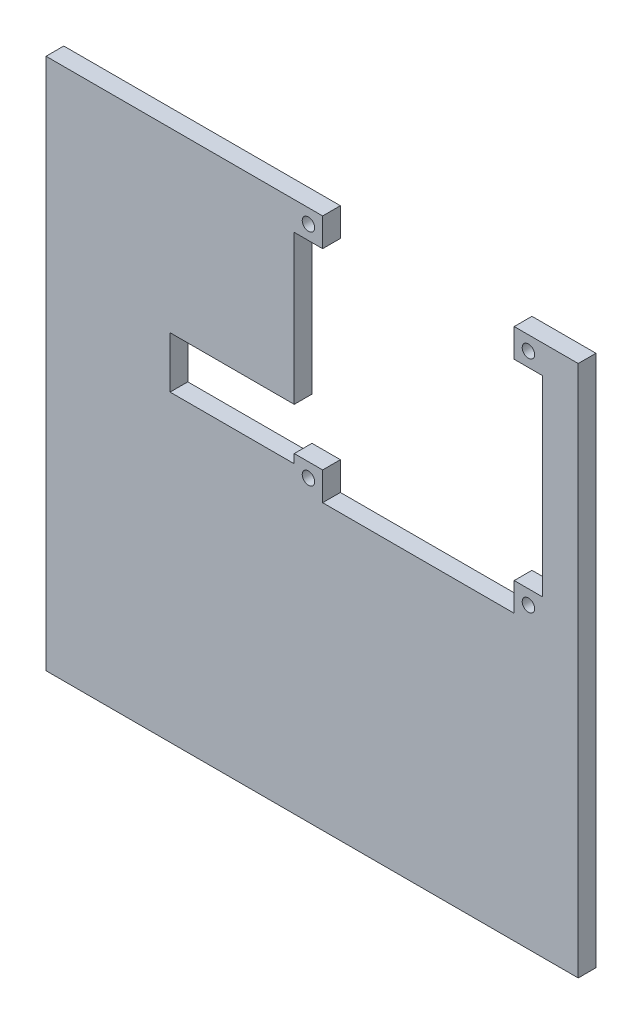
ISO-10303-21;
HEADER;
FILE_DESCRIPTION(('STEP AP214'),'2;1');
FILE_NAME('part.step','',(''),(''),'','','');
FILE_SCHEMA(('AUTOMOTIVE_DESIGN { 1 0 10303 214 1 1 1 1 }'));
ENDSEC;
DATA;
#1=APPLICATION_CONTEXT('core data for automotive mechanical design processes');
#2=APPLICATION_PROTOCOL_DEFINITION('international standard','automotive_design',2000,#1);
#3=PRODUCT_CONTEXT('',#1,'mechanical');
#4=PRODUCT('Part','Part','',(#3));
#5=PRODUCT_RELATED_PRODUCT_CATEGORY('part','',(#4));
#6=PRODUCT_DEFINITION_FORMATION('','',#4);
#7=PRODUCT_DEFINITION_CONTEXT('part definition',#1,'design');
#8=PRODUCT_DEFINITION('design','',#6,#7);
#9=PRODUCT_DEFINITION_SHAPE('','',#8);
#10=(LENGTH_UNIT() NAMED_UNIT(*) SI_UNIT(.MILLI.,.METRE.));
#11=(NAMED_UNIT(*) PLANE_ANGLE_UNIT() SI_UNIT($,.RADIAN.));
#12=(NAMED_UNIT(*) SI_UNIT($,.STERADIAN.) SOLID_ANGLE_UNIT());
#13=UNCERTAINTY_MEASURE_WITH_UNIT(LENGTH_MEASURE(1.E-05),#10,'distance_accuracy_value','');
#14=(GEOMETRIC_REPRESENTATION_CONTEXT(3) GLOBAL_UNCERTAINTY_ASSIGNED_CONTEXT((#13)) GLOBAL_UNIT_ASSIGNED_CONTEXT((#10,
#11,#12)) REPRESENTATION_CONTEXT('',''));
#15=CARTESIAN_POINT('',(0.,0.,0.));
#16=DIRECTION('',(0.,0.,1.));
#17=DIRECTION('',(1.,0.,0.));
#18=AXIS2_PLACEMENT_3D('',#15,#16,#17);
#19=CARTESIAN_POINT('',(0.,150.,5.));
#20=DIRECTION('',(0.,-1.,0.));
#21=DIRECTION('',(0.,0.,-1.));
#22=AXIS2_PLACEMENT_3D('',#19,#20,#21);
#23=PLANE('',#22);
#24=DIRECTION('',(-1.,0.,0.));
#25=VECTOR('',#24,1.);
#26=CARTESIAN_POINT('',(0.,150.,5.));
#27=LINE('',#26,#25);
#28=CARTESIAN_POINT('',(77.9600185654131,150.,5.));
#29=VERTEX_POINT('',#28);
#30=CARTESIAN_POINT('',(0.,150.,5.));
#31=VERTEX_POINT('',#30);
#32=EDGE_CURVE('E328',#29,#31,#27,.T.);
#33=ORIENTED_EDGE('',*,*,#32,.F.);
#34=DIRECTION('',(0.,0.,1.));
#35=VECTOR('',#34,1.);
#36=CARTESIAN_POINT('',(77.9600185654131,150.,0.));
#37=LINE('',#36,#35);
#38=CARTESIAN_POINT('',(77.9600185654131,150.,0.));
#39=VERTEX_POINT('',#38);
#40=EDGE_CURVE('E294',#39,#29,#37,.T.);
#41=ORIENTED_EDGE('',*,*,#40,.F.);
#42=DIRECTION('',(-1.,0.,0.));
#43=VECTOR('',#42,1.);
#44=CARTESIAN_POINT('',(0.,150.,0.));
#45=LINE('',#44,#43);
#46=CARTESIAN_POINT('',(0.,150.,0.));
#47=VERTEX_POINT('',#46);
#48=EDGE_CURVE('E339',#39,#47,#45,.T.);
#49=ORIENTED_EDGE('',*,*,#48,.T.);
#50=DIRECTION('',(0.,0.,-1.));
#51=VECTOR('',#50,1.);
#52=CARTESIAN_POINT('',(0.,150.,5.));
#53=LINE('',#52,#51);
#54=EDGE_CURVE('E332',#31,#47,#53,.T.);
#55=ORIENTED_EDGE('',*,*,#54,.F.);
#56=EDGE_LOOP('',(#33,#41,#49,#55));
#57=FACE_BOUND('',#56,.T.);
#58=ADVANCED_FACE('F32',(#57),#23,.F.);
#59=CARTESIAN_POINT('',(0.,0.,5.));
#60=DIRECTION('',(1.,0.,0.));
#61=DIRECTION('',(0.,0.,-1.));
#62=AXIS2_PLACEMENT_3D('',#59,#60,#61);
#63=PLANE('',#62);
#64=DIRECTION('',(0.,-1.,0.));
#65=VECTOR('',#64,1.);
#66=CARTESIAN_POINT('',(0.,0.,0.));
#67=LINE('',#66,#65);
#68=CARTESIAN_POINT('',(0.,0.,0.));
#69=VERTEX_POINT('',#68);
#70=EDGE_CURVE('E296',#47,#69,#67,.T.);
#71=ORIENTED_EDGE('',*,*,#70,.T.);
#72=DIRECTION('',(0.,0.,-1.));
#73=VECTOR('',#72,1.);
#74=CARTESIAN_POINT('',(0.,0.,5.));
#75=LINE('',#74,#73);
#76=CARTESIAN_POINT('',(0.,0.,5.));
#77=VERTEX_POINT('',#76);
#78=EDGE_CURVE('E11',#77,#69,#75,.T.);
#79=ORIENTED_EDGE('',*,*,#78,.F.);
#80=DIRECTION('',(0.,-1.,0.));
#81=VECTOR('',#80,1.);
#82=CARTESIAN_POINT('',(0.,0.,5.));
#83=LINE('',#82,#81);
#84=EDGE_CURVE('E320',#31,#77,#83,.T.);
#85=ORIENTED_EDGE('',*,*,#84,.F.);
#86=ORIENTED_EDGE('',*,*,#54,.T.);
#87=EDGE_LOOP('',(#71,#79,#85,#86));
#88=FACE_BOUND('',#87,.T.);
#89=ADVANCED_FACE('F34',(#88),#63,.F.);
#90=CARTESIAN_POINT('',(0.,0.,5.));
#91=DIRECTION('',(0.,1.,0.));
#92=DIRECTION('',(0.,0.,1.));
#93=AXIS2_PLACEMENT_3D('',#90,#91,#92);
#94=PLANE('',#93);
#95=DIRECTION('',(1.,0.,0.));
#96=VECTOR('',#95,1.);
#97=CARTESIAN_POINT('',(0.,0.,0.));
#98=LINE('',#97,#96);
#99=CARTESIAN_POINT('',(150.,0.,0.));
#100=VERTEX_POINT('',#99);
#101=EDGE_CURVE('E335',#69,#100,#98,.T.);
#102=ORIENTED_EDGE('',*,*,#101,.T.);
#103=DIRECTION('',(0.,0.,-1.));
#104=VECTOR('',#103,1.);
#105=CARTESIAN_POINT('',(150.,0.,5.));
#106=LINE('',#105,#104);
#107=CARTESIAN_POINT('',(150.,0.,5.));
#108=VERTEX_POINT('',#107);
#109=EDGE_CURVE('E40',#108,#100,#106,.T.);
#110=ORIENTED_EDGE('',*,*,#109,.F.);
#111=DIRECTION('',(1.,0.,0.));
#112=VECTOR('',#111,1.);
#113=CARTESIAN_POINT('',(0.,0.,5.));
#114=LINE('',#113,#112);
#115=EDGE_CURVE('E323',#77,#108,#114,.T.);
#116=ORIENTED_EDGE('',*,*,#115,.F.);
#117=ORIENTED_EDGE('',*,*,#78,.T.);
#118=EDGE_LOOP('',(#102,#110,#116,#117));
#119=FACE_BOUND('',#118,.T.);
#120=ADVANCED_FACE('F367',(#119),#94,.F.);
#121=CARTESIAN_POINT('',(150.,0.,5.));
#122=DIRECTION('',(-1.,0.,0.));
#123=DIRECTION('',(0.,0.,1.));
#124=AXIS2_PLACEMENT_3D('',#121,#122,#123);
#125=PLANE('',#124);
#126=DIRECTION('',(0.,1.,0.));
#127=VECTOR('',#126,1.);
#128=CARTESIAN_POINT('',(150.,0.,0.));
#129=LINE('',#128,#127);
#130=CARTESIAN_POINT('',(150.,150.,0.));
#131=VERTEX_POINT('',#130);
#132=EDGE_CURVE('E337',#100,#131,#129,.T.);
#133=ORIENTED_EDGE('',*,*,#132,.T.);
#134=DIRECTION('',(0.,0.,-1.));
#135=VECTOR('',#134,1.);
#136=CARTESIAN_POINT('',(150.,150.,5.));
#137=LINE('',#136,#135);
#138=CARTESIAN_POINT('',(150.,150.,5.));
#139=VERTEX_POINT('',#138);
#140=EDGE_CURVE('E344',#139,#131,#137,.T.);
#141=ORIENTED_EDGE('',*,*,#140,.F.);
#142=DIRECTION('',(0.,1.,0.));
#143=VECTOR('',#142,1.);
#144=CARTESIAN_POINT('',(150.,0.,5.));
#145=LINE('',#144,#143);
#146=EDGE_CURVE('E326',#108,#139,#145,.T.);
#147=ORIENTED_EDGE('',*,*,#146,.F.);
#148=ORIENTED_EDGE('',*,*,#109,.T.);
#149=EDGE_LOOP('',(#133,#141,#147,#148));
#150=FACE_BOUND('',#149,.T.);
#151=ADVANCED_FACE('F351',(#150),#125,.F.);
#152=CARTESIAN_POINT('',(131.960018565413,150.,0.));
#153=VERTEX_POINT('',#152);
#154=EDGE_CURVE('E324',#131,#153,#45,.T.);
#155=ORIENTED_EDGE('',*,*,#154,.T.);
#156=DIRECTION('',(0.,0.,1.));
#157=VECTOR('',#156,1.);
#158=CARTESIAN_POINT('',(131.960018565413,150.,0.));
#159=LINE('',#158,#157);
#160=CARTESIAN_POINT('',(131.960018565413,150.,5.));
#161=VERTEX_POINT('',#160);
#162=EDGE_CURVE('E297',#153,#161,#159,.T.);
#163=ORIENTED_EDGE('',*,*,#162,.T.);
#164=EDGE_CURVE('E329',#139,#161,#27,.T.);
#165=ORIENTED_EDGE('',*,*,#164,.F.);
#166=ORIENTED_EDGE('',*,*,#140,.T.);
#167=EDGE_LOOP('',(#155,#163,#165,#166));
#168=FACE_BOUND('',#167,.T.);
#169=ADVANCED_FACE('F358',(#168),#23,.F.);
#170=CARTESIAN_POINT('',(0.,0.,5.));
#171=DIRECTION('',(0.,0.,-1.));
#172=DIRECTION('',(-1.,0.,0.));
#173=AXIS2_PLACEMENT_3D('',#170,#171,#172);
#174=PLANE('',#173);
#175=CARTESIAN_POINT('',(135.960018565413,84.,5.));
#176=DIRECTION('',(0.,0.,1.));
#177=DIRECTION('',(1.,0.,0.));
#178=AXIS2_PLACEMENT_3D('',#175,#176,#177);
#179=CIRCLE('',#178,1.75000000000001);
#180=CARTESIAN_POINT('',(137.710018565413,84.,5.));
#181=VERTEX_POINT('',#180);
#182=EDGE_CURVE('E205',#181,#181,#179,.T.);
#183=ORIENTED_EDGE('',*,*,#182,.F.);
#184=EDGE_LOOP('',(#183));
#185=FACE_BOUND('',#184,.T.);
#186=CARTESIAN_POINT('',(135.960018565413,146.,5.));
#187=DIRECTION('',(0.,0.,1.));
#188=DIRECTION('',(1.,0.,0.));
#189=AXIS2_PLACEMENT_3D('',#186,#187,#188);
#190=CIRCLE('',#189,1.75000000000001);
#191=CARTESIAN_POINT('',(137.710018565413,146.,5.));
#192=VERTEX_POINT('',#191);
#193=EDGE_CURVE('E224',#192,#192,#190,.T.);
#194=ORIENTED_EDGE('',*,*,#193,.F.);
#195=EDGE_LOOP('',(#194));
#196=FACE_BOUND('',#195,.T.);
#197=CARTESIAN_POINT('',(73.9600185654131,146.,5.));
#198=DIRECTION('',(0.,0.,1.));
#199=DIRECTION('',(1.,0.,0.));
#200=AXIS2_PLACEMENT_3D('',#197,#198,#199);
#201=CIRCLE('',#200,1.75);
#202=CARTESIAN_POINT('',(75.7100185654131,146.,5.));
#203=VERTEX_POINT('',#202);
#204=EDGE_CURVE('E218',#203,#203,#201,.T.);
#205=ORIENTED_EDGE('',*,*,#204,.F.);
#206=EDGE_LOOP('',(#205));
#207=FACE_BOUND('',#206,.T.);
#208=CARTESIAN_POINT('',(73.960018565413,84.,5.));
#209=DIRECTION('',(0.,0.,1.));
#210=DIRECTION('',(1.,0.,0.));
#211=AXIS2_PLACEMENT_3D('',#208,#209,#210);
#212=CIRCLE('',#211,1.75);
#213=CARTESIAN_POINT('',(75.710018565413,84.,5.));
#214=VERTEX_POINT('',#213);
#215=EDGE_CURVE('E212',#214,#214,#212,.T.);
#216=ORIENTED_EDGE('',*,*,#215,.F.);
#217=EDGE_LOOP('',(#216));
#218=FACE_BOUND('',#217,.T.);
#219=DIRECTION('',(1.,0.,0.));
#220=VECTOR('',#219,1.);
#221=CARTESIAN_POINT('',(77.9600185654131,87.9999999999999,5.));
#222=LINE('',#221,#220);
#223=CARTESIAN_POINT('',(69.960018565413,87.9999999999999,5.));
#224=VERTEX_POINT('',#223);
#225=CARTESIAN_POINT('',(77.9600185654131,87.9999999999999,5.));
#226=VERTEX_POINT('',#225);
#227=EDGE_CURVE('E272',#224,#226,#222,.T.);
#228=ORIENTED_EDGE('',*,*,#227,.F.);
#229=DIRECTION('',(0.,1.,0.));
#230=VECTOR('',#229,1.);
#231=CARTESIAN_POINT('',(69.960018565413,85.5,5.));
#232=LINE('',#231,#230);
#233=CARTESIAN_POINT('',(69.960018565413,85.5,5.));
#234=VERTEX_POINT('',#233);
#235=EDGE_CURVE('E196',#234,#224,#232,.T.);
#236=ORIENTED_EDGE('',*,*,#235,.F.);
#237=DIRECTION('',(1.,0.,0.));
#238=VECTOR('',#237,1.);
#239=CARTESIAN_POINT('',(69.960018565413,85.5,5.));
#240=LINE('',#239,#238);
#241=CARTESIAN_POINT('',(34.960018565413,85.5,5.));
#242=VERTEX_POINT('',#241);
#243=EDGE_CURVE('E192',#242,#234,#240,.T.);
#244=ORIENTED_EDGE('',*,*,#243,.F.);
#245=DIRECTION('',(0.,-1.,0.));
#246=VECTOR('',#245,1.);
#247=CARTESIAN_POINT('',(34.960018565413,85.5,5.));
#248=LINE('',#247,#246);
#249=CARTESIAN_POINT('',(34.960018565413,100.,5.));
#250=VERTEX_POINT('',#249);
#251=EDGE_CURVE('E199',#250,#242,#248,.T.);
#252=ORIENTED_EDGE('',*,*,#251,.F.);
#253=DIRECTION('',(-1.,0.,0.));
#254=VECTOR('',#253,1.);
#255=CARTESIAN_POINT('',(69.960018565413,100.,5.));
#256=LINE('',#255,#254);
#257=CARTESIAN_POINT('',(69.960018565413,100.,5.));
#258=VERTEX_POINT('',#257);
#259=EDGE_CURVE('E171',#258,#250,#256,.T.);
#260=ORIENTED_EDGE('',*,*,#259,.F.);
#261=DIRECTION('',(0.,-1.,0.));
#262=VECTOR('',#261,1.);
#263=CARTESIAN_POINT('',(69.960018565413,87.9999999999999,5.));
#264=LINE('',#263,#262);
#265=CARTESIAN_POINT('',(69.960018565413,142.,5.));
#266=VERTEX_POINT('',#265);
#267=EDGE_CURVE('E269',#266,#258,#264,.T.);
#268=ORIENTED_EDGE('',*,*,#267,.F.);
#269=DIRECTION('',(-1.,0.,0.));
#270=VECTOR('',#269,1.);
#271=CARTESIAN_POINT('',(69.960018565413,142.,5.));
#272=LINE('',#271,#270);
#273=CARTESIAN_POINT('',(77.9600185654131,142.,5.));
#274=VERTEX_POINT('',#273);
#275=EDGE_CURVE('E266',#274,#266,#272,.T.);
#276=ORIENTED_EDGE('',*,*,#275,.F.);
#277=DIRECTION('',(0.,-1.,0.));
#278=VECTOR('',#277,1.);
#279=CARTESIAN_POINT('',(77.9600185654131,142.,5.));
#280=LINE('',#279,#278);
#281=EDGE_CURVE('E211',#29,#274,#280,.T.);
#282=ORIENTED_EDGE('',*,*,#281,.F.);
#283=ORIENTED_EDGE('',*,*,#32,.T.);
#284=ORIENTED_EDGE('',*,*,#84,.T.);
#285=ORIENTED_EDGE('',*,*,#115,.T.);
#286=ORIENTED_EDGE('',*,*,#146,.T.);
#287=ORIENTED_EDGE('',*,*,#164,.T.);
#288=DIRECTION('',(0.,1.,0.));
#289=VECTOR('',#288,1.);
#290=CARTESIAN_POINT('',(131.960018565413,150.,5.));
#291=LINE('',#290,#289);
#292=CARTESIAN_POINT('',(131.960018565413,142.,5.));
#293=VERTEX_POINT('',#292);
#294=EDGE_CURVE('E236',#293,#161,#291,.T.);
#295=ORIENTED_EDGE('',*,*,#294,.F.);
#296=DIRECTION('',(-1.,0.,0.));
#297=VECTOR('',#296,1.);
#298=CARTESIAN_POINT('',(131.960018565413,142.,5.));
#299=LINE('',#298,#297);
#300=CARTESIAN_POINT('',(139.960018565413,142.,5.));
#301=VERTEX_POINT('',#300);
#302=EDGE_CURVE('E290',#301,#293,#299,.T.);
#303=ORIENTED_EDGE('',*,*,#302,.F.);
#304=DIRECTION('',(0.,1.,0.));
#305=VECTOR('',#304,1.);
#306=CARTESIAN_POINT('',(139.960018565413,142.,5.));
#307=LINE('',#306,#305);
#308=CARTESIAN_POINT('',(139.960018565413,88.,5.));
#309=VERTEX_POINT('',#308);
#310=EDGE_CURVE('E287',#309,#301,#307,.T.);
#311=ORIENTED_EDGE('',*,*,#310,.F.);
#312=DIRECTION('',(1.,0.,0.));
#313=VECTOR('',#312,1.);
#314=CARTESIAN_POINT('',(139.960018565413,88.,5.));
#315=LINE('',#314,#313);
#316=CARTESIAN_POINT('',(131.960018565413,88.,5.));
#317=VERTEX_POINT('',#316);
#318=EDGE_CURVE('E284',#317,#309,#315,.T.);
#319=ORIENTED_EDGE('',*,*,#318,.F.);
#320=DIRECTION('',(0.,1.,0.));
#321=VECTOR('',#320,1.);
#322=CARTESIAN_POINT('',(131.960018565413,88.,5.));
#323=LINE('',#322,#321);
#324=CARTESIAN_POINT('',(131.960018565413,80.,5.));
#325=VERTEX_POINT('',#324);
#326=EDGE_CURVE('E281',#325,#317,#323,.T.);
#327=ORIENTED_EDGE('',*,*,#326,.F.);
#328=DIRECTION('',(1.,0.,0.));
#329=VECTOR('',#328,1.);
#330=CARTESIAN_POINT('',(131.960018565413,80.,5.));
#331=LINE('',#330,#329);
#332=CARTESIAN_POINT('',(77.9600185654131,80.,5.));
#333=VERTEX_POINT('',#332);
#334=EDGE_CURVE('E278',#333,#325,#331,.T.);
#335=ORIENTED_EDGE('',*,*,#334,.F.);
#336=DIRECTION('',(0.,-1.,0.));
#337=VECTOR('',#336,1.);
#338=CARTESIAN_POINT('',(77.9600185654131,80.,5.));
#339=LINE('',#338,#337);
#340=EDGE_CURVE('E275',#226,#333,#339,.T.);
#341=ORIENTED_EDGE('',*,*,#340,.F.);
#342=EDGE_LOOP('',(#228,#236,#244,#252,#260,#268,#276,#282,#283,#284,#285,#286,#287,#295,#303,
#311,#319,#327,#335,#341));
#343=FACE_BOUND('',#342,.T.);
#344=ADVANCED_FACE('F363',(#185,#196,#207,#218,#343),#174,.F.);
#345=CARTESIAN_POINT('',(0.,0.,0.));
#346=DIRECTION('',(0.,0.,-1.));
#347=DIRECTION('',(-1.,0.,0.));
#348=AXIS2_PLACEMENT_3D('',#345,#346,#347);
#349=PLANE('',#348);
#350=DIRECTION('',(0.,1.,0.));
#351=VECTOR('',#350,1.);
#352=CARTESIAN_POINT('',(69.960018565413,85.5,0.));
#353=LINE('',#352,#351);
#354=CARTESIAN_POINT('',(69.960018565413,85.5,0.));
#355=VERTEX_POINT('',#354);
#356=CARTESIAN_POINT('',(69.960018565413,87.9999999999999,0.));
#357=VERTEX_POINT('',#356);
#358=EDGE_CURVE('E190',#355,#357,#353,.T.);
#359=ORIENTED_EDGE('',*,*,#358,.T.);
#360=DIRECTION('',(1.,0.,0.));
#361=VECTOR('',#360,1.);
#362=CARTESIAN_POINT('',(77.9600185654131,87.9999999999999,0.));
#363=LINE('',#362,#361);
#364=CARTESIAN_POINT('',(77.9600185654131,87.9999999999999,0.));
#365=VERTEX_POINT('',#364);
#366=EDGE_CURVE('E239',#357,#365,#363,.T.);
#367=ORIENTED_EDGE('',*,*,#366,.T.);
#368=DIRECTION('',(0.,-1.,0.));
#369=VECTOR('',#368,1.);
#370=CARTESIAN_POINT('',(77.9600185654131,80.,0.));
#371=LINE('',#370,#369);
#372=CARTESIAN_POINT('',(77.9600185654131,80.,0.));
#373=VERTEX_POINT('',#372);
#374=EDGE_CURVE('E242',#365,#373,#371,.T.);
#375=ORIENTED_EDGE('',*,*,#374,.T.);
#376=DIRECTION('',(1.,0.,0.));
#377=VECTOR('',#376,1.);
#378=CARTESIAN_POINT('',(131.960018565413,80.,0.));
#379=LINE('',#378,#377);
#380=CARTESIAN_POINT('',(131.960018565413,80.,0.));
#381=VERTEX_POINT('',#380);
#382=EDGE_CURVE('E245',#373,#381,#379,.T.);
#383=ORIENTED_EDGE('',*,*,#382,.T.);
#384=DIRECTION('',(0.,1.,0.));
#385=VECTOR('',#384,1.);
#386=CARTESIAN_POINT('',(131.960018565413,88.,0.));
#387=LINE('',#386,#385);
#388=CARTESIAN_POINT('',(131.960018565413,88.,0.));
#389=VERTEX_POINT('',#388);
#390=EDGE_CURVE('E248',#381,#389,#387,.T.);
#391=ORIENTED_EDGE('',*,*,#390,.T.);
#392=DIRECTION('',(1.,0.,0.));
#393=VECTOR('',#392,1.);
#394=CARTESIAN_POINT('',(139.960018565413,88.,0.));
#395=LINE('',#394,#393);
#396=CARTESIAN_POINT('',(139.960018565413,88.,0.));
#397=VERTEX_POINT('',#396);
#398=EDGE_CURVE('E251',#389,#397,#395,.T.);
#399=ORIENTED_EDGE('',*,*,#398,.T.);
#400=DIRECTION('',(0.,1.,0.));
#401=VECTOR('',#400,1.);
#402=CARTESIAN_POINT('',(139.960018565413,142.,0.));
#403=LINE('',#402,#401);
#404=CARTESIAN_POINT('',(139.960018565413,142.,0.));
#405=VERTEX_POINT('',#404);
#406=EDGE_CURVE('E254',#397,#405,#403,.T.);
#407=ORIENTED_EDGE('',*,*,#406,.T.);
#408=DIRECTION('',(-1.,0.,0.));
#409=VECTOR('',#408,1.);
#410=CARTESIAN_POINT('',(131.960018565413,142.,0.));
#411=LINE('',#410,#409);
#412=CARTESIAN_POINT('',(131.960018565413,142.,0.));
#413=VERTEX_POINT('',#412);
#414=EDGE_CURVE('E257',#405,#413,#411,.T.);
#415=ORIENTED_EDGE('',*,*,#414,.T.);
#416=DIRECTION('',(0.,1.,0.));
#417=VECTOR('',#416,1.);
#418=CARTESIAN_POINT('',(131.960018565413,150.,0.));
#419=LINE('',#418,#417);
#420=EDGE_CURVE('E260',#413,#153,#419,.T.);
#421=ORIENTED_EDGE('',*,*,#420,.T.);
#422=ORIENTED_EDGE('',*,*,#154,.F.);
#423=ORIENTED_EDGE('',*,*,#132,.F.);
#424=ORIENTED_EDGE('',*,*,#101,.F.);
#425=ORIENTED_EDGE('',*,*,#70,.F.);
#426=ORIENTED_EDGE('',*,*,#48,.F.);
#427=DIRECTION('',(0.,-1.,0.));
#428=VECTOR('',#427,1.);
#429=CARTESIAN_POINT('',(77.9600185654131,142.,0.));
#430=LINE('',#429,#428);
#431=CARTESIAN_POINT('',(77.9600185654131,142.,0.));
#432=VERTEX_POINT('',#431);
#433=EDGE_CURVE('E232',#39,#432,#430,.T.);
#434=ORIENTED_EDGE('',*,*,#433,.T.);
#435=DIRECTION('',(-1.,0.,0.));
#436=VECTOR('',#435,1.);
#437=CARTESIAN_POINT('',(69.960018565413,142.,0.));
#438=LINE('',#437,#436);
#439=CARTESIAN_POINT('',(69.960018565413,142.,0.));
#440=VERTEX_POINT('',#439);
#441=EDGE_CURVE('E235',#432,#440,#438,.T.);
#442=ORIENTED_EDGE('',*,*,#441,.T.);
#443=DIRECTION('',(0.,-1.,0.));
#444=VECTOR('',#443,1.);
#445=CARTESIAN_POINT('',(69.960018565413,87.9999999999999,0.));
#446=LINE('',#445,#444);
#447=CARTESIAN_POINT('',(69.960018565413,100.,0.));
#448=VERTEX_POINT('',#447);
#449=EDGE_CURVE('E54',#440,#448,#446,.T.);
#450=ORIENTED_EDGE('',*,*,#449,.T.);
#451=DIRECTION('',(-1.,0.,0.));
#452=VECTOR('',#451,1.);
#453=CARTESIAN_POINT('',(69.960018565413,100.,0.));
#454=LINE('',#453,#452);
#455=CARTESIAN_POINT('',(34.960018565413,100.,0.));
#456=VERTEX_POINT('',#455);
#457=EDGE_CURVE('E47',#448,#456,#454,.T.);
#458=ORIENTED_EDGE('',*,*,#457,.T.);
#459=DIRECTION('',(0.,-1.,0.));
#460=VECTOR('',#459,1.);
#461=CARTESIAN_POINT('',(34.960018565413,85.5,0.));
#462=LINE('',#461,#460);
#463=CARTESIAN_POINT('',(34.960018565413,85.5,0.));
#464=VERTEX_POINT('',#463);
#465=EDGE_CURVE('E179',#456,#464,#462,.T.);
#466=ORIENTED_EDGE('',*,*,#465,.T.);
#467=DIRECTION('',(1.,0.,0.));
#468=VECTOR('',#467,1.);
#469=CARTESIAN_POINT('',(69.960018565413,85.5,0.));
#470=LINE('',#469,#468);
#471=EDGE_CURVE('E184',#464,#355,#470,.T.);
#472=ORIENTED_EDGE('',*,*,#471,.T.);
#473=EDGE_LOOP('',(#359,#367,#375,#383,#391,#399,#407,#415,#421,#422,#423,#424,#425,#426,#434,
#442,#450,#458,#466,#472));
#474=FACE_BOUND('',#473,.T.);
#475=CARTESIAN_POINT('',(135.960018565413,84.,0.));
#476=DIRECTION('',(0.,0.,1.));
#477=DIRECTION('',(1.,0.,0.));
#478=AXIS2_PLACEMENT_3D('',#475,#476,#477);
#479=CIRCLE('',#478,1.75000000000001);
#480=CARTESIAN_POINT('',(137.710018565413,84.,0.));
#481=VERTEX_POINT('',#480);
#482=EDGE_CURVE('E227',#481,#481,#479,.T.);
#483=ORIENTED_EDGE('',*,*,#482,.T.);
#484=EDGE_LOOP('',(#483));
#485=FACE_BOUND('',#484,.T.);
#486=CARTESIAN_POINT('',(135.960018565413,146.,0.));
#487=DIRECTION('',(0.,0.,1.));
#488=DIRECTION('',(1.,0.,0.));
#489=AXIS2_PLACEMENT_3D('',#486,#487,#488);
#490=CIRCLE('',#489,1.75000000000001);
#491=CARTESIAN_POINT('',(137.710018565413,146.,0.));
#492=VERTEX_POINT('',#491);
#493=EDGE_CURVE('E221',#492,#492,#490,.T.);
#494=ORIENTED_EDGE('',*,*,#493,.T.);
#495=EDGE_LOOP('',(#494));
#496=FACE_BOUND('',#495,.T.);
#497=CARTESIAN_POINT('',(73.9600185654131,146.,0.));
#498=DIRECTION('',(0.,0.,1.));
#499=DIRECTION('',(1.,0.,0.));
#500=AXIS2_PLACEMENT_3D('',#497,#498,#499);
#501=CIRCLE('',#500,1.75);
#502=CARTESIAN_POINT('',(75.7100185654131,146.,0.));
#503=VERTEX_POINT('',#502);
#504=EDGE_CURVE('E215',#503,#503,#501,.T.);
#505=ORIENTED_EDGE('',*,*,#504,.T.);
#506=EDGE_LOOP('',(#505));
#507=FACE_BOUND('',#506,.T.);
#508=CARTESIAN_POINT('',(73.960018565413,84.,0.));
#509=DIRECTION('',(0.,0.,1.));
#510=DIRECTION('',(1.,0.,0.));
#511=AXIS2_PLACEMENT_3D('',#508,#509,#510);
#512=CIRCLE('',#511,1.75);
#513=CARTESIAN_POINT('',(75.710018565413,84.,0.));
#514=VERTEX_POINT('',#513);
#515=EDGE_CURVE('E208',#514,#514,#512,.T.);
#516=ORIENTED_EDGE('',*,*,#515,.T.);
#517=EDGE_LOOP('',(#516));
#518=FACE_BOUND('',#517,.T.);
#519=ADVANCED_FACE('F187',(#474,#485,#496,#507,#518),#349,.T.);
#520=CARTESIAN_POINT('',(77.9600185654131,142.,0.));
#521=DIRECTION('',(-1.,0.,0.));
#522=DIRECTION('',(0.,0.,1.));
#523=AXIS2_PLACEMENT_3D('',#520,#521,#522);
#524=PLANE('',#523);
#525=ORIENTED_EDGE('',*,*,#281,.T.);
#526=DIRECTION('',(0.,0.,1.));
#527=VECTOR('',#526,1.);
#528=CARTESIAN_POINT('',(77.9600185654131,142.,0.));
#529=LINE('',#528,#527);
#530=EDGE_CURVE('E263',#432,#274,#529,.T.);
#531=ORIENTED_EDGE('',*,*,#530,.F.);
#532=ORIENTED_EDGE('',*,*,#433,.F.);
#533=ORIENTED_EDGE('',*,*,#40,.T.);
#534=EDGE_LOOP('',(#525,#531,#532,#533));
#535=FACE_BOUND('',#534,.T.);
#536=ADVANCED_FACE('F376',(#535),#524,.F.);
#537=CARTESIAN_POINT('',(131.960018565413,150.,0.));
#538=DIRECTION('',(1.,0.,0.));
#539=DIRECTION('',(0.,0.,-1.));
#540=AXIS2_PLACEMENT_3D('',#537,#538,#539);
#541=PLANE('',#540);
#542=ORIENTED_EDGE('',*,*,#294,.T.);
#543=ORIENTED_EDGE('',*,*,#162,.F.);
#544=ORIENTED_EDGE('',*,*,#420,.F.);
#545=DIRECTION('',(0.,0.,1.));
#546=VECTOR('',#545,1.);
#547=CARTESIAN_POINT('',(131.960018565413,142.,0.));
#548=LINE('',#547,#546);
#549=EDGE_CURVE('E300',#413,#293,#548,.T.);
#550=ORIENTED_EDGE('',*,*,#549,.T.);
#551=EDGE_LOOP('',(#542,#543,#544,#550));
#552=FACE_BOUND('',#551,.T.);
#553=ADVANCED_FACE('F416',(#552),#541,.F.);
#554=CARTESIAN_POINT('',(131.960018565413,142.,0.));
#555=DIRECTION('',(0.,1.,0.));
#556=DIRECTION('',(-1.,0.,0.));
#557=AXIS2_PLACEMENT_3D('',#554,#555,#556);
#558=PLANE('',#557);
#559=ORIENTED_EDGE('',*,*,#302,.T.);
#560=ORIENTED_EDGE('',*,*,#549,.F.);
#561=ORIENTED_EDGE('',*,*,#414,.F.);
#562=DIRECTION('',(0.,0.,1.));
#563=VECTOR('',#562,1.);
#564=CARTESIAN_POINT('',(139.960018565413,142.,0.));
#565=LINE('',#564,#563);
#566=EDGE_CURVE('E302',#405,#301,#565,.T.);
#567=ORIENTED_EDGE('',*,*,#566,.T.);
#568=EDGE_LOOP('',(#559,#560,#561,#567));
#569=FACE_BOUND('',#568,.T.);
#570=ADVANCED_FACE('F414',(#569),#558,.F.);
#571=CARTESIAN_POINT('',(139.960018565413,142.,0.));
#572=DIRECTION('',(1.,0.,0.));
#573=DIRECTION('',(0.,1.,0.));
#574=AXIS2_PLACEMENT_3D('',#571,#572,#573);
#575=PLANE('',#574);
#576=ORIENTED_EDGE('',*,*,#310,.T.);
#577=ORIENTED_EDGE('',*,*,#566,.F.);
#578=ORIENTED_EDGE('',*,*,#406,.F.);
#579=DIRECTION('',(0.,0.,1.));
#580=VECTOR('',#579,1.);
#581=CARTESIAN_POINT('',(139.960018565413,88.,0.));
#582=LINE('',#581,#580);
#583=EDGE_CURVE('E304',#397,#309,#582,.T.);
#584=ORIENTED_EDGE('',*,*,#583,.T.);
#585=EDGE_LOOP('',(#576,#577,#578,#584));
#586=FACE_BOUND('',#585,.T.);
#587=ADVANCED_FACE('F411',(#586),#575,.F.);
#588=CARTESIAN_POINT('',(139.960018565413,88.,0.));
#589=DIRECTION('',(0.,-1.,0.));
#590=DIRECTION('',(0.,0.,-1.));
#591=AXIS2_PLACEMENT_3D('',#588,#589,#590);
#592=PLANE('',#591);
#593=ORIENTED_EDGE('',*,*,#318,.T.);
#594=ORIENTED_EDGE('',*,*,#583,.F.);
#595=ORIENTED_EDGE('',*,*,#398,.F.);
#596=DIRECTION('',(0.,0.,1.));
#597=VECTOR('',#596,1.);
#598=CARTESIAN_POINT('',(131.960018565413,88.,0.));
#599=LINE('',#598,#597);
#600=EDGE_CURVE('E306',#389,#317,#599,.T.);
#601=ORIENTED_EDGE('',*,*,#600,.T.);
#602=EDGE_LOOP('',(#593,#594,#595,#601));
#603=FACE_BOUND('',#602,.T.);
#604=ADVANCED_FACE('F407',(#603),#592,.F.);
#605=CARTESIAN_POINT('',(131.960018565413,88.,0.));
#606=DIRECTION('',(1.,0.,0.));
#607=DIRECTION('',(0.,0.,-1.));
#608=AXIS2_PLACEMENT_3D('',#605,#606,#607);
#609=PLANE('',#608);
#610=ORIENTED_EDGE('',*,*,#326,.T.);
#611=ORIENTED_EDGE('',*,*,#600,.F.);
#612=ORIENTED_EDGE('',*,*,#390,.F.);
#613=DIRECTION('',(0.,0.,1.));
#614=VECTOR('',#613,1.);
#615=CARTESIAN_POINT('',(131.960018565413,80.,0.));
#616=LINE('',#615,#614);
#617=EDGE_CURVE('E308',#381,#325,#616,.T.);
#618=ORIENTED_EDGE('',*,*,#617,.T.);
#619=EDGE_LOOP('',(#610,#611,#612,#618));
#620=FACE_BOUND('',#619,.T.);
#621=ADVANCED_FACE('F403',(#620),#609,.F.);
#622=CARTESIAN_POINT('',(131.960018565413,80.,0.));
#623=DIRECTION('',(0.,-1.,0.));
#624=DIRECTION('',(0.,0.,-1.));
#625=AXIS2_PLACEMENT_3D('',#622,#623,#624);
#626=PLANE('',#625);
#627=ORIENTED_EDGE('',*,*,#334,.T.);
#628=ORIENTED_EDGE('',*,*,#617,.F.);
#629=ORIENTED_EDGE('',*,*,#382,.F.);
#630=DIRECTION('',(0.,0.,1.));
#631=VECTOR('',#630,1.);
#632=CARTESIAN_POINT('',(77.9600185654131,80.,0.));
#633=LINE('',#632,#631);
#634=EDGE_CURVE('E310',#373,#333,#633,.T.);
#635=ORIENTED_EDGE('',*,*,#634,.T.);
#636=EDGE_LOOP('',(#627,#628,#629,#635));
#637=FACE_BOUND('',#636,.T.);
#638=ADVANCED_FACE('F399',(#637),#626,.F.);
#639=CARTESIAN_POINT('',(77.9600185654131,80.,0.));
#640=DIRECTION('',(-1.,0.,0.));
#641=DIRECTION('',(0.,0.,1.));
#642=AXIS2_PLACEMENT_3D('',#639,#640,#641);
#643=PLANE('',#642);
#644=ORIENTED_EDGE('',*,*,#340,.T.);
#645=ORIENTED_EDGE('',*,*,#634,.F.);
#646=ORIENTED_EDGE('',*,*,#374,.F.);
#647=DIRECTION('',(0.,0.,1.));
#648=VECTOR('',#647,1.);
#649=CARTESIAN_POINT('',(77.9600185654131,87.9999999999999,0.));
#650=LINE('',#649,#648);
#651=EDGE_CURVE('E312',#365,#226,#650,.T.);
#652=ORIENTED_EDGE('',*,*,#651,.T.);
#653=EDGE_LOOP('',(#644,#645,#646,#652));
#654=FACE_BOUND('',#653,.T.);
#655=ADVANCED_FACE('F395',(#654),#643,.F.);
#656=CARTESIAN_POINT('',(77.9600185654131,87.9999999999999,0.));
#657=DIRECTION('',(0.,-1.,0.));
#658=DIRECTION('',(0.,0.,-1.));
#659=AXIS2_PLACEMENT_3D('',#656,#657,#658);
#660=PLANE('',#659);
#661=ORIENTED_EDGE('',*,*,#227,.T.);
#662=ORIENTED_EDGE('',*,*,#651,.F.);
#663=ORIENTED_EDGE('',*,*,#366,.F.);
#664=DIRECTION('',(0.,0.,1.));
#665=VECTOR('',#664,1.);
#666=CARTESIAN_POINT('',(69.960018565413,87.9999999999999,0.));
#667=LINE('',#666,#665);
#668=EDGE_CURVE('E314',#357,#224,#667,.T.);
#669=ORIENTED_EDGE('',*,*,#668,.T.);
#670=EDGE_LOOP('',(#661,#662,#663,#669));
#671=FACE_BOUND('',#670,.T.);
#672=ADVANCED_FACE('F391',(#671),#660,.F.);
#673=CARTESIAN_POINT('',(69.960018565413,87.9999999999999,0.));
#674=DIRECTION('',(-1.,0.,0.));
#675=DIRECTION('',(0.,-1.,0.));
#676=AXIS2_PLACEMENT_3D('',#673,#674,#675);
#677=PLANE('',#676);
#678=ORIENTED_EDGE('',*,*,#267,.T.);
#679=DIRECTION('',(0.,0.,1.));
#680=VECTOR('',#679,1.);
#681=CARTESIAN_POINT('',(69.960018565413,100.,0.));
#682=LINE('',#681,#680);
#683=EDGE_CURVE('E176',#448,#258,#682,.T.);
#684=ORIENTED_EDGE('',*,*,#683,.F.);
#685=ORIENTED_EDGE('',*,*,#449,.F.);
#686=DIRECTION('',(0.,0.,1.));
#687=VECTOR('',#686,1.);
#688=CARTESIAN_POINT('',(69.960018565413,142.,0.));
#689=LINE('',#688,#687);
#690=EDGE_CURVE('E317',#440,#266,#689,.T.);
#691=ORIENTED_EDGE('',*,*,#690,.T.);
#692=EDGE_LOOP('',(#678,#684,#685,#691));
#693=FACE_BOUND('',#692,.T.);
#694=ADVANCED_FACE('F382',(#693),#677,.F.);
#695=CARTESIAN_POINT('',(69.960018565413,142.,0.));
#696=DIRECTION('',(0.,1.,0.));
#697=DIRECTION('',(0.,0.,1.));
#698=AXIS2_PLACEMENT_3D('',#695,#696,#697);
#699=PLANE('',#698);
#700=ORIENTED_EDGE('',*,*,#275,.T.);
#701=ORIENTED_EDGE('',*,*,#690,.F.);
#702=ORIENTED_EDGE('',*,*,#441,.F.);
#703=ORIENTED_EDGE('',*,*,#530,.T.);
#704=EDGE_LOOP('',(#700,#701,#702,#703));
#705=FACE_BOUND('',#704,.T.);
#706=ADVANCED_FACE('F380',(#705),#699,.F.);
#707=CARTESIAN_POINT('',(73.960018565413,84.,0.));
#708=DIRECTION('',(0.,0.,1.));
#709=DIRECTION('',(1.,0.,0.));
#710=AXIS2_PLACEMENT_3D('',#707,#708,#709);
#711=CYLINDRICAL_SURFACE('',#710,1.75);
#712=ORIENTED_EDGE('',*,*,#515,.F.);
#713=EDGE_LOOP('',(#712));
#714=FACE_BOUND('',#713,.T.);
#715=ORIENTED_EDGE('',*,*,#215,.T.);
#716=EDGE_LOOP('',(#715));
#717=FACE_BOUND('',#716,.T.);
#718=ADVANCED_FACE('F547',(#714,#717),#711,.F.);
#719=CARTESIAN_POINT('',(73.9600185654131,146.,0.));
#720=DIRECTION('',(0.,0.,1.));
#721=DIRECTION('',(1.,0.,0.));
#722=AXIS2_PLACEMENT_3D('',#719,#720,#721);
#723=CYLINDRICAL_SURFACE('',#722,1.75);
#724=ORIENTED_EDGE('',*,*,#504,.F.);
#725=EDGE_LOOP('',(#724));
#726=FACE_BOUND('',#725,.T.);
#727=ORIENTED_EDGE('',*,*,#204,.T.);
#728=EDGE_LOOP('',(#727));
#729=FACE_BOUND('',#728,.T.);
#730=ADVANCED_FACE('F555',(#726,#729),#723,.F.);
#731=CARTESIAN_POINT('',(135.960018565413,146.,0.));
#732=DIRECTION('',(0.,0.,1.));
#733=DIRECTION('',(1.,0.,0.));
#734=AXIS2_PLACEMENT_3D('',#731,#732,#733);
#735=CYLINDRICAL_SURFACE('',#734,1.75000000000001);
#736=ORIENTED_EDGE('',*,*,#493,.F.);
#737=EDGE_LOOP('',(#736));
#738=FACE_BOUND('',#737,.T.);
#739=ORIENTED_EDGE('',*,*,#193,.T.);
#740=EDGE_LOOP('',(#739));
#741=FACE_BOUND('',#740,.T.);
#742=ADVANCED_FACE('F564',(#738,#741),#735,.F.);
#743=CARTESIAN_POINT('',(135.960018565413,84.,0.));
#744=DIRECTION('',(0.,0.,1.));
#745=DIRECTION('',(1.,0.,0.));
#746=AXIS2_PLACEMENT_3D('',#743,#744,#745);
#747=CYLINDRICAL_SURFACE('',#746,1.75000000000001);
#748=ORIENTED_EDGE('',*,*,#482,.F.);
#749=EDGE_LOOP('',(#748));
#750=FACE_BOUND('',#749,.T.);
#751=ORIENTED_EDGE('',*,*,#182,.T.);
#752=EDGE_LOOP('',(#751));
#753=FACE_BOUND('',#752,.T.);
#754=ADVANCED_FACE('F573',(#750,#753),#747,.F.);
#755=CARTESIAN_POINT('',(69.960018565413,85.5,0.));
#756=DIRECTION('',(1.,0.,0.));
#757=DIRECTION('',(0.,0.,-1.));
#758=AXIS2_PLACEMENT_3D('',#755,#756,#757);
#759=PLANE('',#758);
#760=ORIENTED_EDGE('',*,*,#358,.F.);
#761=DIRECTION('',(0.,0.,1.));
#762=VECTOR('',#761,1.);
#763=CARTESIAN_POINT('',(69.960018565413,85.5,0.));
#764=LINE('',#763,#762);
#765=EDGE_CURVE('E203',#355,#234,#764,.T.);
#766=ORIENTED_EDGE('',*,*,#765,.T.);
#767=ORIENTED_EDGE('',*,*,#235,.T.);
#768=ORIENTED_EDGE('',*,*,#668,.F.);
#769=EDGE_LOOP('',(#760,#766,#767,#768));
#770=FACE_BOUND('',#769,.T.);
#771=ADVANCED_FACE('F582',(#770),#759,.F.);
#772=CARTESIAN_POINT('',(69.960018565413,85.5,0.));
#773=DIRECTION('',(0.,-1.,0.));
#774=DIRECTION('',(0.,0.,-1.));
#775=AXIS2_PLACEMENT_3D('',#772,#773,#774);
#776=PLANE('',#775);
#777=ORIENTED_EDGE('',*,*,#243,.T.);
#778=ORIENTED_EDGE('',*,*,#765,.F.);
#779=ORIENTED_EDGE('',*,*,#471,.F.);
#780=DIRECTION('',(0.,0.,1.));
#781=VECTOR('',#780,1.);
#782=CARTESIAN_POINT('',(34.960018565413,85.5,0.));
#783=LINE('',#782,#781);
#784=EDGE_CURVE('E175',#464,#242,#783,.T.);
#785=ORIENTED_EDGE('',*,*,#784,.T.);
#786=EDGE_LOOP('',(#777,#778,#779,#785));
#787=FACE_BOUND('',#786,.T.);
#788=ADVANCED_FACE('F386',(#787),#776,.F.);
#789=CARTESIAN_POINT('',(34.960018565413,85.5,0.));
#790=DIRECTION('',(-1.,0.,0.));
#791=DIRECTION('',(0.,0.,1.));
#792=AXIS2_PLACEMENT_3D('',#789,#790,#791);
#793=PLANE('',#792);
#794=ORIENTED_EDGE('',*,*,#251,.T.);
#795=ORIENTED_EDGE('',*,*,#784,.F.);
#796=ORIENTED_EDGE('',*,*,#465,.F.);
#797=DIRECTION('',(0.,0.,1.));
#798=VECTOR('',#797,1.);
#799=CARTESIAN_POINT('',(34.960018565413,100.,0.));
#800=LINE('',#799,#798);
#801=EDGE_CURVE('E167',#456,#250,#800,.T.);
#802=ORIENTED_EDGE('',*,*,#801,.T.);
#803=EDGE_LOOP('',(#794,#795,#796,#802));
#804=FACE_BOUND('',#803,.T.);
#805=ADVANCED_FACE('F180',(#804),#793,.F.);
#806=CARTESIAN_POINT('',(69.960018565413,100.,0.));
#807=DIRECTION('',(0.,1.,0.));
#808=DIRECTION('',(0.,0.,1.));
#809=AXIS2_PLACEMENT_3D('',#806,#807,#808);
#810=PLANE('',#809);
#811=ORIENTED_EDGE('',*,*,#259,.T.);
#812=ORIENTED_EDGE('',*,*,#801,.F.);
#813=ORIENTED_EDGE('',*,*,#457,.F.);
#814=ORIENTED_EDGE('',*,*,#683,.T.);
#815=EDGE_LOOP('',(#811,#812,#813,#814));
#816=FACE_BOUND('',#815,.T.);
#817=ADVANCED_FACE('F169',(#816),#810,.F.);
#818=CLOSED_SHELL('',(#58,#89,#120,#151,#169,#344,#519,#536,#553,#570,#587,#604,#621,#638,#655,
#672,#694,#706,#718,#730,#742,#754,#771,#788,#805,#817));
#819=MANIFOLD_SOLID_BREP('B2',#818);
#820=ADVANCED_BREP_SHAPE_REPRESENTATION('',(#18,#819),#14);
#821=SHAPE_DEFINITION_REPRESENTATION(#9,#820);
ENDSEC;
END-ISO-10303-21;
